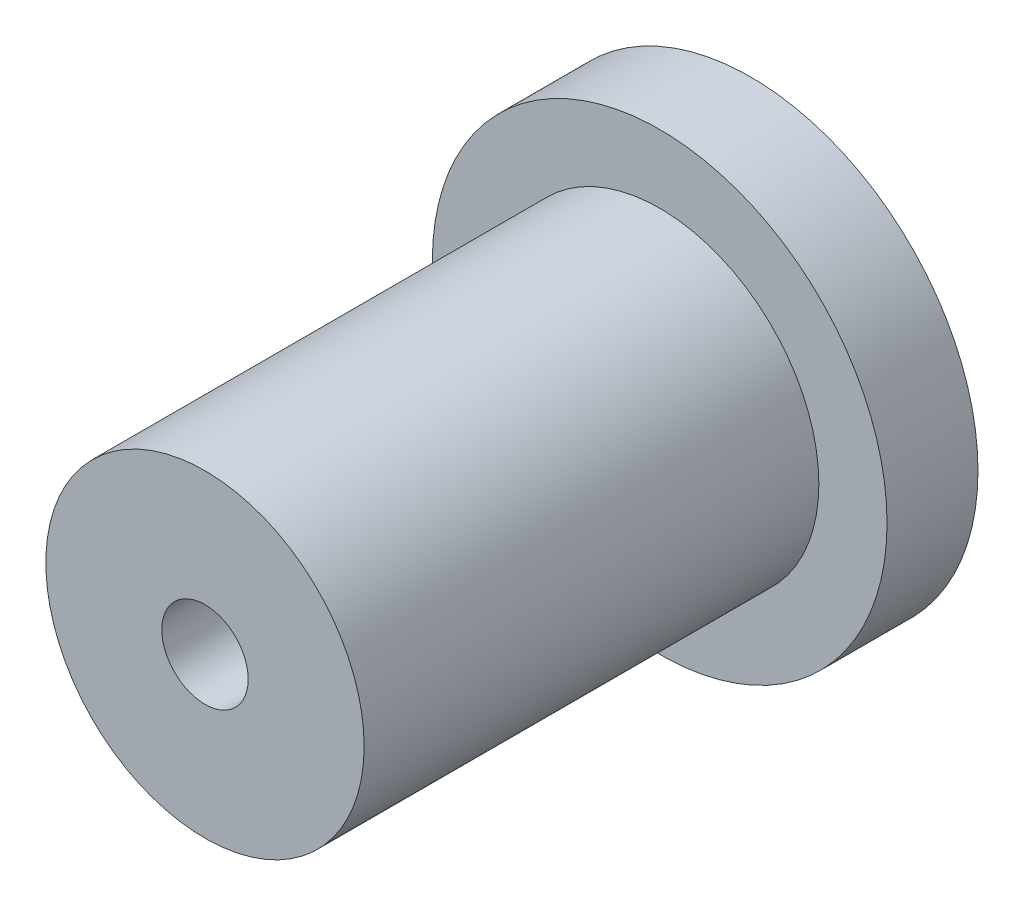
ISO-10303-21;
HEADER;
FILE_DESCRIPTION(('STEP AP214'),'2;1');
FILE_NAME('part.step','',(''),(''),'','','');
FILE_SCHEMA(('AUTOMOTIVE_DESIGN { 1 0 10303 214 1 1 1 1 }'));
ENDSEC;
DATA;
#1=APPLICATION_CONTEXT('core data for automotive mechanical design processes');
#2=APPLICATION_PROTOCOL_DEFINITION('international standard','automotive_design',2000,#1);
#3=PRODUCT_CONTEXT('',#1,'mechanical');
#4=PRODUCT('Part','Part','',(#3));
#5=PRODUCT_RELATED_PRODUCT_CATEGORY('part','',(#4));
#6=PRODUCT_DEFINITION_FORMATION('','',#4);
#7=PRODUCT_DEFINITION_CONTEXT('part definition',#1,'design');
#8=PRODUCT_DEFINITION('design','',#6,#7);
#9=PRODUCT_DEFINITION_SHAPE('','',#8);
#10=(LENGTH_UNIT() NAMED_UNIT(*) SI_UNIT(.MILLI.,.METRE.));
#11=(NAMED_UNIT(*) PLANE_ANGLE_UNIT() SI_UNIT($,.RADIAN.));
#12=(NAMED_UNIT(*) SI_UNIT($,.STERADIAN.) SOLID_ANGLE_UNIT());
#13=UNCERTAINTY_MEASURE_WITH_UNIT(LENGTH_MEASURE(1.E-05),#10,'distance_accuracy_value','');
#14=(GEOMETRIC_REPRESENTATION_CONTEXT(3) GLOBAL_UNCERTAINTY_ASSIGNED_CONTEXT((#13)) GLOBAL_UNIT_ASSIGNED_CONTEXT((#10,
#11,#12)) REPRESENTATION_CONTEXT('',''));
#15=CARTESIAN_POINT('',(0.,0.,0.));
#16=DIRECTION('',(0.,0.,1.));
#17=DIRECTION('',(1.,0.,0.));
#18=AXIS2_PLACEMENT_3D('',#15,#16,#17);
#19=CARTESIAN_POINT('',(0.,0.,2.));
#20=DIRECTION('',(0.,0.,-1.));
#21=DIRECTION('',(-1.,0.,0.));
#22=AXIS2_PLACEMENT_3D('',#19,#20,#21);
#23=CYLINDRICAL_SURFACE('',#22,5.);
#24=CARTESIAN_POINT('',(0.,0.,2.));
#25=DIRECTION('',(0.,0.,1.));
#26=DIRECTION('',(1.,0.,0.));
#27=AXIS2_PLACEMENT_3D('',#24,#25,#26);
#28=CIRCLE('',#27,5.);
#29=CARTESIAN_POINT('',(5.,0.,2.));
#30=VERTEX_POINT('',#29);
#31=EDGE_CURVE('E40',#30,#30,#28,.T.);
#32=ORIENTED_EDGE('',*,*,#31,.F.);
#33=EDGE_LOOP('',(#32));
#34=FACE_BOUND('',#33,.T.);
#35=CARTESIAN_POINT('',(0.,0.,0.));
#36=DIRECTION('',(0.,0.,1.));
#37=DIRECTION('',(1.,0.,0.));
#38=AXIS2_PLACEMENT_3D('',#35,#36,#37);
#39=CIRCLE('',#38,5.);
#40=CARTESIAN_POINT('',(5.,0.,0.));
#41=VERTEX_POINT('',#40);
#42=EDGE_CURVE('E36',#41,#41,#39,.T.);
#43=ORIENTED_EDGE('',*,*,#42,.T.);
#44=EDGE_LOOP('',(#43));
#45=FACE_BOUND('',#44,.T.);
#46=ADVANCED_FACE('F33',(#34,#45),#23,.T.);
#47=CARTESIAN_POINT('',(0.,0.,2.));
#48=DIRECTION('',(0.,0.,1.));
#49=DIRECTION('',(1.,0.,0.));
#50=AXIS2_PLACEMENT_3D('',#47,#48,#49);
#51=PLANE('',#50);
#52=CARTESIAN_POINT('',(0.,0.,2.));
#53=DIRECTION('',(0.,0.,1.));
#54=DIRECTION('',(1.,0.,0.));
#55=AXIS2_PLACEMENT_3D('',#52,#53,#54);
#56=CIRCLE('',#55,3.5);
#57=CARTESIAN_POINT('',(3.5,0.,2.));
#58=VERTEX_POINT('',#57);
#59=EDGE_CURVE('E10',#58,#58,#56,.T.);
#60=ORIENTED_EDGE('',*,*,#59,.F.);
#61=EDGE_LOOP('',(#60));
#62=FACE_BOUND('',#61,.T.);
#63=ORIENTED_EDGE('',*,*,#31,.T.);
#64=EDGE_LOOP('',(#63));
#65=FACE_BOUND('',#64,.T.);
#66=ADVANCED_FACE('F77',(#62,#65),#51,.T.);
#67=CARTESIAN_POINT('',(0.,0.,0.));
#68=DIRECTION('',(0.,0.,1.));
#69=DIRECTION('',(1.,0.,0.));
#70=AXIS2_PLACEMENT_3D('',#67,#68,#69);
#71=PLANE('',#70);
#72=CARTESIAN_POINT('',(0.,0.,0.));
#73=DIRECTION('',(0.,0.,1.));
#74=DIRECTION('',(1.,0.,0.));
#75=AXIS2_PLACEMENT_3D('',#72,#73,#74);
#76=CIRCLE('',#75,0.95);
#77=CARTESIAN_POINT('',(0.95,0.,0.));
#78=VERTEX_POINT('',#77);
#79=EDGE_CURVE('E49',#78,#78,#76,.T.);
#80=ORIENTED_EDGE('',*,*,#79,.T.);
#81=EDGE_LOOP('',(#80));
#82=FACE_BOUND('',#81,.T.);
#83=ORIENTED_EDGE('',*,*,#42,.F.);
#84=EDGE_LOOP('',(#83));
#85=FACE_BOUND('',#84,.T.);
#86=ADVANCED_FACE('F56',(#82,#85),#71,.F.);
#87=CARTESIAN_POINT('',(0.,0.,12.));
#88=DIRECTION('',(0.,0.,-1.));
#89=DIRECTION('',(-1.,0.,0.));
#90=AXIS2_PLACEMENT_3D('',#87,#88,#89);
#91=CYLINDRICAL_SURFACE('',#90,3.5);
#92=CARTESIAN_POINT('',(0.,0.,12.));
#93=DIRECTION('',(0.,0.,1.));
#94=DIRECTION('',(1.,0.,0.));
#95=AXIS2_PLACEMENT_3D('',#92,#93,#94);
#96=CIRCLE('',#95,3.5);
#97=CARTESIAN_POINT('',(3.5,0.,12.));
#98=VERTEX_POINT('',#97);
#99=EDGE_CURVE('E46',#98,#98,#96,.T.);
#100=ORIENTED_EDGE('',*,*,#99,.F.);
#101=EDGE_LOOP('',(#100));
#102=FACE_BOUND('',#101,.T.);
#103=ORIENTED_EDGE('',*,*,#59,.T.);
#104=EDGE_LOOP('',(#103));
#105=FACE_BOUND('',#104,.T.);
#106=ADVANCED_FACE('F68',(#102,#105),#91,.T.);
#107=CARTESIAN_POINT('',(0.,0.,12.));
#108=DIRECTION('',(0.,0.,1.));
#109=DIRECTION('',(1.,0.,0.));
#110=AXIS2_PLACEMENT_3D('',#107,#108,#109);
#111=PLANE('',#110);
#112=CARTESIAN_POINT('',(0.,0.,12.));
#113=DIRECTION('',(0.,0.,1.));
#114=DIRECTION('',(1.,0.,0.));
#115=AXIS2_PLACEMENT_3D('',#112,#113,#114);
#116=CIRCLE('',#115,0.95);
#117=CARTESIAN_POINT('',(0.95,0.,12.));
#118=VERTEX_POINT('',#117);
#119=EDGE_CURVE('E50',#118,#118,#116,.T.);
#120=ORIENTED_EDGE('',*,*,#119,.F.);
#121=EDGE_LOOP('',(#120));
#122=FACE_BOUND('',#121,.T.);
#123=ORIENTED_EDGE('',*,*,#99,.T.);
#124=EDGE_LOOP('',(#123));
#125=FACE_BOUND('',#124,.T.);
#126=ADVANCED_FACE('F62',(#122,#125),#111,.T.);
#127=CARTESIAN_POINT('',(0.,0.,0.));
#128=DIRECTION('',(0.,0.,1.));
#129=DIRECTION('',(1.,0.,0.));
#130=AXIS2_PLACEMENT_3D('',#127,#128,#129);
#131=CYLINDRICAL_SURFACE('',#130,0.95);
#132=ORIENTED_EDGE('',*,*,#79,.F.);
#133=EDGE_LOOP('',(#132));
#134=FACE_BOUND('',#133,.T.);
#135=ORIENTED_EDGE('',*,*,#119,.T.);
#136=EDGE_LOOP('',(#135));
#137=FACE_BOUND('',#136,.T.);
#138=ADVANCED_FACE('F59',(#134,#137),#131,.F.);
#139=CLOSED_SHELL('',(#46,#66,#86,#106,#126,#138));
#140=MANIFOLD_SOLID_BREP('B2',#139);
#141=ADVANCED_BREP_SHAPE_REPRESENTATION('',(#18,#140),#14);
#142=SHAPE_DEFINITION_REPRESENTATION(#9,#141);
ENDSEC;
END-ISO-10303-21;
